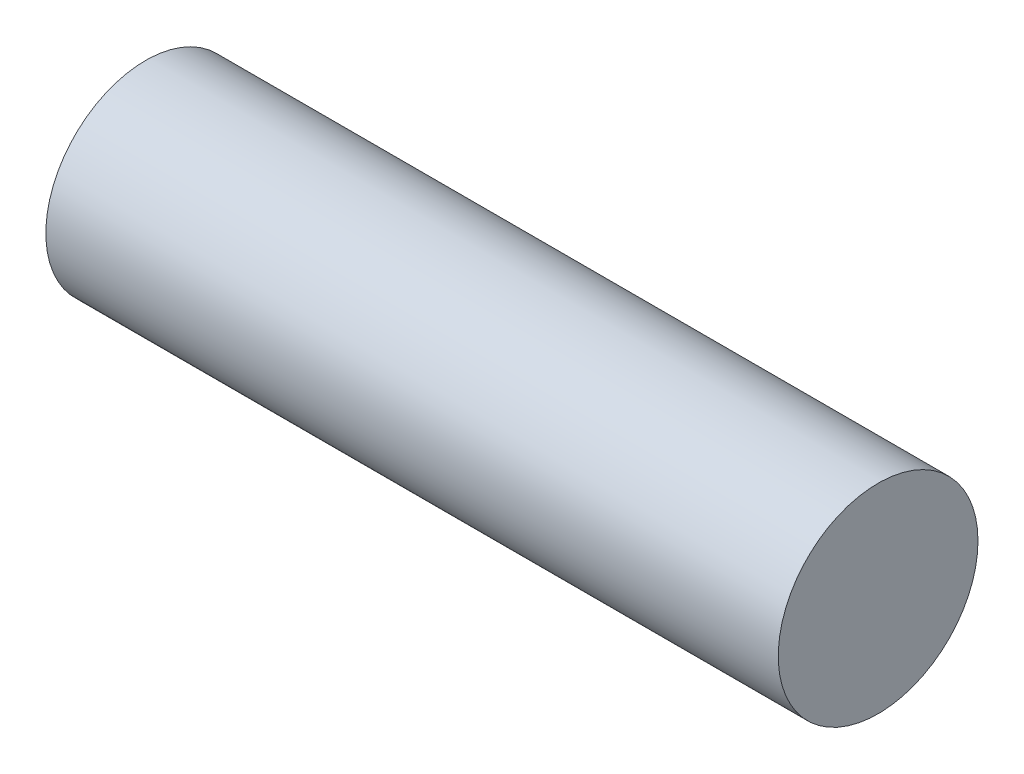
ISO-10303-21;
HEADER;
FILE_DESCRIPTION(('STEP AP214'),'2;1');
FILE_NAME('part.step','',(''),(''),'','','');
FILE_SCHEMA(('AUTOMOTIVE_DESIGN { 1 0 10303 214 1 1 1 1 }'));
ENDSEC;
DATA;
#1=APPLICATION_CONTEXT('core data for automotive mechanical design processes');
#2=APPLICATION_PROTOCOL_DEFINITION('international standard','automotive_design',2000,#1);
#3=PRODUCT_CONTEXT('',#1,'mechanical');
#4=PRODUCT('Part','Part','',(#3));
#5=PRODUCT_RELATED_PRODUCT_CATEGORY('part','',(#4));
#6=PRODUCT_DEFINITION_FORMATION('','',#4);
#7=PRODUCT_DEFINITION_CONTEXT('part definition',#1,'design');
#8=PRODUCT_DEFINITION('design','',#6,#7);
#9=PRODUCT_DEFINITION_SHAPE('','',#8);
#10=(LENGTH_UNIT() NAMED_UNIT(*) SI_UNIT(.MILLI.,.METRE.));
#11=(NAMED_UNIT(*) PLANE_ANGLE_UNIT() SI_UNIT($,.RADIAN.));
#12=(NAMED_UNIT(*) SI_UNIT($,.STERADIAN.) SOLID_ANGLE_UNIT());
#13=UNCERTAINTY_MEASURE_WITH_UNIT(LENGTH_MEASURE(1.E-05),#10,'distance_accuracy_value','');
#14=(GEOMETRIC_REPRESENTATION_CONTEXT(3) GLOBAL_UNCERTAINTY_ASSIGNED_CONTEXT((#13)) GLOBAL_UNIT_ASSIGNED_CONTEXT((#10,
#11,#12)) REPRESENTATION_CONTEXT('',''));
#15=CARTESIAN_POINT('',(0.,0.,0.));
#16=DIRECTION('',(0.,0.,1.));
#17=DIRECTION('',(1.,0.,0.));
#18=AXIS2_PLACEMENT_3D('',#15,#16,#17);
#19=CARTESIAN_POINT('',(55.,0.,0.));
#20=DIRECTION('',(-1.,0.,0.));
#21=DIRECTION('',(0.,0.,1.));
#22=AXIS2_PLACEMENT_3D('',#19,#20,#21);
#23=CYLINDRICAL_SURFACE('',#22,7.5);
#24=CARTESIAN_POINT('',(55.,0.,0.));
#25=DIRECTION('',(1.,0.,0.));
#26=DIRECTION('',(0.,0.,-1.));
#27=AXIS2_PLACEMENT_3D('',#24,#25,#26);
#28=CIRCLE('',#27,7.5);
#29=CARTESIAN_POINT('',(55.,0.,-7.5));
#30=VERTEX_POINT('',#29);
#31=EDGE_CURVE('E10',#30,#30,#28,.T.);
#32=ORIENTED_EDGE('',*,*,#31,.F.);
#33=EDGE_LOOP('',(#32));
#34=FACE_BOUND('',#33,.T.);
#35=CARTESIAN_POINT('',(0.,0.,0.));
#36=DIRECTION('',(1.,0.,0.));
#37=DIRECTION('',(0.,0.,-1.));
#38=AXIS2_PLACEMENT_3D('',#35,#36,#37);
#39=CIRCLE('',#38,7.5);
#40=CARTESIAN_POINT('',(0.,0.,-7.5));
#41=VERTEX_POINT('',#40);
#42=EDGE_CURVE('E34',#41,#41,#39,.T.);
#43=ORIENTED_EDGE('',*,*,#42,.T.);
#44=EDGE_LOOP('',(#43));
#45=FACE_BOUND('',#44,.T.);
#46=ADVANCED_FACE('F31',(#34,#45),#23,.T.);
#47=CARTESIAN_POINT('',(55.,0.,0.));
#48=DIRECTION('',(1.,0.,0.));
#49=DIRECTION('',(0.,0.,-1.));
#50=AXIS2_PLACEMENT_3D('',#47,#48,#49);
#51=PLANE('',#50);
#52=ORIENTED_EDGE('',*,*,#31,.T.);
#53=EDGE_LOOP('',(#52));
#54=FACE_BOUND('',#53,.T.);
#55=ADVANCED_FACE('F46',(#54),#51,.T.);
#56=CARTESIAN_POINT('',(0.,0.,0.));
#57=DIRECTION('',(1.,0.,0.));
#58=DIRECTION('',(0.,0.,-1.));
#59=AXIS2_PLACEMENT_3D('',#56,#57,#58);
#60=PLANE('',#59);
#61=ORIENTED_EDGE('',*,*,#42,.F.);
#62=EDGE_LOOP('',(#61));
#63=FACE_BOUND('',#62,.T.);
#64=ADVANCED_FACE('F44',(#63),#60,.F.);
#65=CLOSED_SHELL('',(#46,#55,#64));
#66=MANIFOLD_SOLID_BREP('B2',#65);
#67=ADVANCED_BREP_SHAPE_REPRESENTATION('',(#18,#66),#14);
#68=SHAPE_DEFINITION_REPRESENTATION(#9,#67);
ENDSEC;
END-ISO-10303-21;
